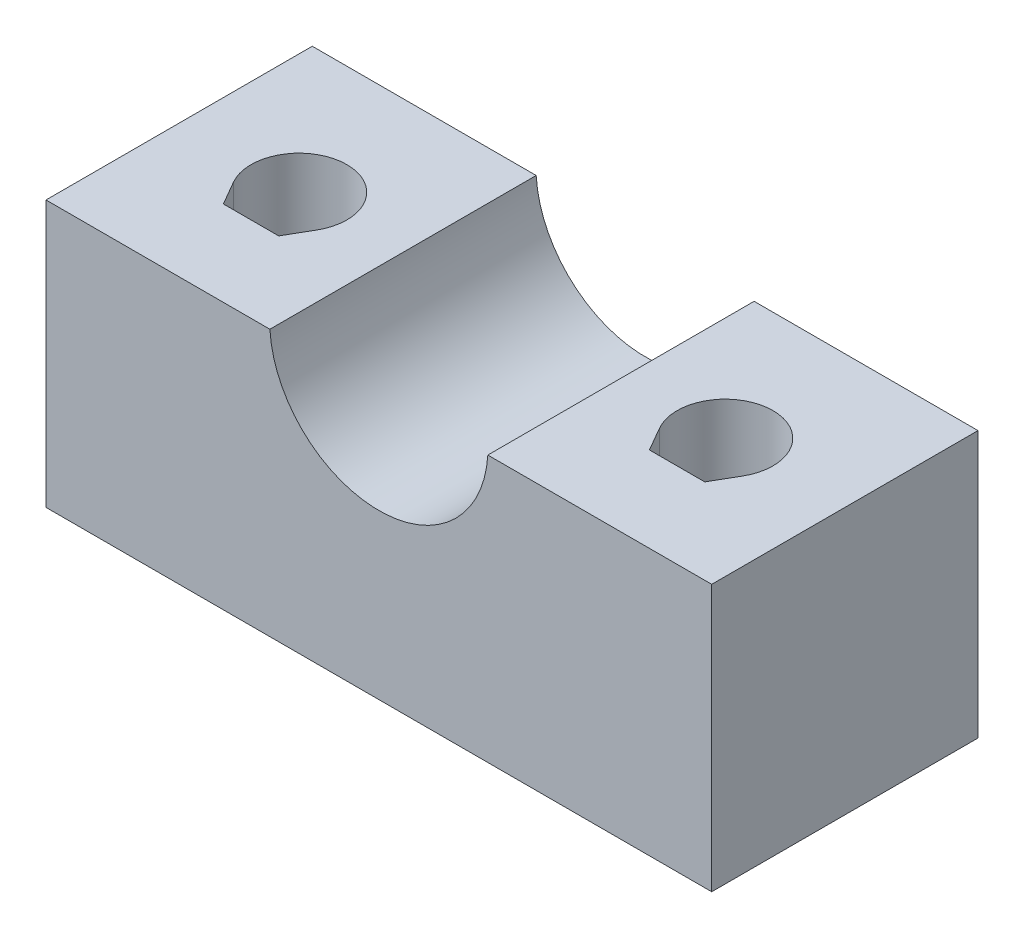
ISO-10303-21;
HEADER;
FILE_DESCRIPTION(('STEP AP214'),'2;1');
FILE_NAME('part.step','',(''),(''),'','','');
FILE_SCHEMA(('AUTOMOTIVE_DESIGN { 1 0 10303 214 1 1 1 1 }'));
ENDSEC;
DATA;
#1=APPLICATION_CONTEXT('core data for automotive mechanical design processes');
#2=APPLICATION_PROTOCOL_DEFINITION('international standard','automotive_design',2000,#1);
#3=PRODUCT_CONTEXT('',#1,'mechanical');
#4=PRODUCT('Part','Part','',(#3));
#5=PRODUCT_RELATED_PRODUCT_CATEGORY('part','',(#4));
#6=PRODUCT_DEFINITION_FORMATION('','',#4);
#7=PRODUCT_DEFINITION_CONTEXT('part definition',#1,'design');
#8=PRODUCT_DEFINITION('design','',#6,#7);
#9=PRODUCT_DEFINITION_SHAPE('','',#8);
#10=(LENGTH_UNIT() NAMED_UNIT(*) SI_UNIT(.MILLI.,.METRE.));
#11=(NAMED_UNIT(*) PLANE_ANGLE_UNIT() SI_UNIT($,.RADIAN.));
#12=(NAMED_UNIT(*) SI_UNIT($,.STERADIAN.) SOLID_ANGLE_UNIT());
#13=UNCERTAINTY_MEASURE_WITH_UNIT(LENGTH_MEASURE(1.E-05),#10,'distance_accuracy_value','');
#14=(GEOMETRIC_REPRESENTATION_CONTEXT(3) GLOBAL_UNCERTAINTY_ASSIGNED_CONTEXT((#13)) GLOBAL_UNIT_ASSIGNED_CONTEXT((#10,
#11,#12)) REPRESENTATION_CONTEXT('',''));
#15=CARTESIAN_POINT('',(0.,0.,0.));
#16=DIRECTION('',(0.,0.,1.));
#17=DIRECTION('',(1.,0.,0.));
#18=AXIS2_PLACEMENT_3D('',#15,#16,#17);
#19=CARTESIAN_POINT('',(-12.5,-5.,5.));
#20=DIRECTION('',(0.,1.,0.));
#21=DIRECTION('',(0.,0.,1.));
#22=AXIS2_PLACEMENT_3D('',#19,#20,#21);
#23=PLANE('',#22);
#24=DIRECTION('',(1.,0.,0.));
#25=VECTOR('',#24,1.);
#26=CARTESIAN_POINT('',(-12.5,-5.,-5.));
#27=LINE('',#26,#25);
#28=CARTESIAN_POINT('',(-12.5,-5.,-5.));
#29=VERTEX_POINT('',#28);
#30=CARTESIAN_POINT('',(12.5,-5.,-5.));
#31=VERTEX_POINT('',#30);
#32=EDGE_CURVE('E218',#29,#31,#27,.T.);
#33=ORIENTED_EDGE('',*,*,#32,.T.);
#34=DIRECTION('',(0.,0.,-1.));
#35=VECTOR('',#34,1.);
#36=CARTESIAN_POINT('',(12.5,-5.,5.));
#37=LINE('',#36,#35);
#38=CARTESIAN_POINT('',(12.5,-5.,5.));
#39=VERTEX_POINT('',#38);
#40=EDGE_CURVE('E228',#39,#31,#37,.T.);
#41=ORIENTED_EDGE('',*,*,#40,.F.);
#42=DIRECTION('',(1.,0.,0.));
#43=VECTOR('',#42,1.);
#44=CARTESIAN_POINT('',(-12.5,-5.,5.));
#45=LINE('',#44,#43);
#46=CARTESIAN_POINT('',(-12.5,-5.,5.));
#47=VERTEX_POINT('',#46);
#48=EDGE_CURVE('E202',#47,#39,#45,.T.);
#49=ORIENTED_EDGE('',*,*,#48,.F.);
#50=DIRECTION('',(0.,0.,-1.));
#51=VECTOR('',#50,1.);
#52=CARTESIAN_POINT('',(-12.5,-5.,5.));
#53=LINE('',#52,#51);
#54=EDGE_CURVE('E226',#47,#29,#53,.T.);
#55=ORIENTED_EDGE('',*,*,#54,.T.);
#56=EDGE_LOOP('',(#33,#41,#49,#55));
#57=FACE_BOUND('',#56,.T.);
#58=CARTESIAN_POINT('',(-8.,-5.,0.));
#59=DIRECTION('',(0.,-1.,0.));
#60=DIRECTION('',(0.,0.,-1.));
#61=AXIS2_PLACEMENT_3D('',#58,#59,#60);
#62=CIRCLE('',#61,1.8);
#63=CARTESIAN_POINT('',(-9.55884572681199,-5.,0.900000000000008));
#64=VERTEX_POINT('',#63);
#65=CARTESIAN_POINT('',(-6.44115427318801,-5.,0.900000000000008));
#66=VERTEX_POINT('',#65);
#67=EDGE_CURVE('E171',#64,#66,#62,.T.);
#68=ORIENTED_EDGE('',*,*,#67,.F.);
#69=DIRECTION('',(-0.500000000000004,0.,-0.866025403784436));
#70=VECTOR('',#69,1.);
#71=CARTESIAN_POINT('',(-9.03923048454132,-5.,1.8));
#72=LINE('',#71,#70);
#73=CARTESIAN_POINT('',(-9.03923048454132,-5.,1.8));
#74=VERTEX_POINT('',#73);
#75=EDGE_CURVE('E169',#74,#64,#72,.T.);
#76=ORIENTED_EDGE('',*,*,#75,.F.);
#77=DIRECTION('',(-1.,0.,0.));
#78=VECTOR('',#77,1.);
#79=CARTESIAN_POINT('',(-6.96076951545868,-5.,1.8));
#80=LINE('',#79,#78);
#81=CARTESIAN_POINT('',(-6.96076951545868,-5.,1.8));
#82=VERTEX_POINT('',#81);
#83=EDGE_CURVE('E177',#82,#74,#80,.T.);
#84=ORIENTED_EDGE('',*,*,#83,.F.);
#85=DIRECTION('',(0.500000000000005,0.,-0.866025403784436));
#86=VECTOR('',#85,1.);
#87=CARTESIAN_POINT('',(-6.96076951545868,-5.,1.8));
#88=LINE('',#87,#86);
#89=EDGE_CURVE('E174',#82,#66,#88,.T.);
#90=ORIENTED_EDGE('',*,*,#89,.T.);
#91=EDGE_LOOP('',(#68,#76,#84,#90));
#92=FACE_BOUND('',#91,.T.);
#93=DIRECTION('',(0.500000000000004,0.,-0.866025403784436));
#94=VECTOR('',#93,1.);
#95=CARTESIAN_POINT('',(9.03923048454132,-5.,1.8));
#96=LINE('',#95,#94);
#97=CARTESIAN_POINT('',(9.03923048454132,-5.,1.8));
#98=VERTEX_POINT('',#97);
#99=CARTESIAN_POINT('',(9.55884572681199,-5.,0.900000000000009));
#100=VERTEX_POINT('',#99);
#101=EDGE_CURVE('E52',#98,#100,#96,.T.);
#102=ORIENTED_EDGE('',*,*,#101,.T.);
#103=CARTESIAN_POINT('',(8.,-5.,0.));
#104=DIRECTION('',(0.,1.,0.));
#105=DIRECTION('',(0.,0.,1.));
#106=AXIS2_PLACEMENT_3D('',#103,#104,#105);
#107=CIRCLE('',#106,1.8);
#108=CARTESIAN_POINT('',(6.44115427318801,-5.,0.900000000000009));
#109=VERTEX_POINT('',#108);
#110=EDGE_CURVE('E143',#100,#109,#107,.T.);
#111=ORIENTED_EDGE('',*,*,#110,.T.);
#112=DIRECTION('',(-0.500000000000003,0.,-0.866025403784437));
#113=VECTOR('',#112,1.);
#114=CARTESIAN_POINT('',(6.96076951545868,-5.,1.8));
#115=LINE('',#114,#113);
#116=CARTESIAN_POINT('',(6.96076951545868,-5.,1.8));
#117=VERTEX_POINT('',#116);
#118=EDGE_CURVE('E268',#117,#109,#115,.T.);
#119=ORIENTED_EDGE('',*,*,#118,.F.);
#120=DIRECTION('',(1.,0.,0.));
#121=VECTOR('',#120,1.);
#122=CARTESIAN_POINT('',(6.96076951545868,-5.,1.8));
#123=LINE('',#122,#121);
#124=EDGE_CURVE('E267',#117,#98,#123,.T.);
#125=ORIENTED_EDGE('',*,*,#124,.T.);
#126=EDGE_LOOP('',(#102,#111,#119,#125));
#127=FACE_BOUND('',#126,.T.);
#128=ADVANCED_FACE('F35',(#57,#92,#127),#23,.F.);
#129=CARTESIAN_POINT('',(4.09237095092808,5.,5.));
#130=DIRECTION('',(0.,1.,0.));
#131=DIRECTION('',(0.,0.,1.));
#132=AXIS2_PLACEMENT_3D('',#129,#130,#131);
#133=PLANE('',#132);
#134=DIRECTION('',(1.,0.,0.));
#135=VECTOR('',#134,1.);
#136=CARTESIAN_POINT('',(4.09237095092808,5.,-5.));
#137=LINE('',#136,#135);
#138=CARTESIAN_POINT('',(4.09237095092808,5.,-5.));
#139=VERTEX_POINT('',#138);
#140=CARTESIAN_POINT('',(12.5,5.,-5.));
#141=VERTEX_POINT('',#140);
#142=EDGE_CURVE('E212',#139,#141,#137,.T.);
#143=ORIENTED_EDGE('',*,*,#142,.F.);
#144=DIRECTION('',(0.,0.,-1.));
#145=VECTOR('',#144,1.);
#146=CARTESIAN_POINT('',(4.09237095092808,5.,5.));
#147=LINE('',#146,#145);
#148=CARTESIAN_POINT('',(4.09237095092808,5.,5.));
#149=VERTEX_POINT('',#148);
#150=EDGE_CURVE('E39',#149,#139,#147,.T.);
#151=ORIENTED_EDGE('',*,*,#150,.F.);
#152=DIRECTION('',(1.,0.,0.));
#153=VECTOR('',#152,1.);
#154=CARTESIAN_POINT('',(4.09237095092808,5.,5.));
#155=LINE('',#154,#153);
#156=CARTESIAN_POINT('',(12.5,5.,5.));
#157=VERTEX_POINT('',#156);
#158=EDGE_CURVE('E196',#149,#157,#155,.T.);
#159=ORIENTED_EDGE('',*,*,#158,.T.);
#160=DIRECTION('',(0.,0.,-1.));
#161=VECTOR('',#160,1.);
#162=CARTESIAN_POINT('',(12.5,5.,5.));
#163=LINE('',#162,#161);
#164=EDGE_CURVE('E230',#157,#141,#163,.T.);
#165=ORIENTED_EDGE('',*,*,#164,.T.);
#166=EDGE_LOOP('',(#143,#151,#159,#165));
#167=FACE_BOUND('',#166,.T.);
#168=CARTESIAN_POINT('',(8.,5.,0.));
#169=DIRECTION('',(0.,1.,0.));
#170=DIRECTION('',(0.,0.,1.));
#171=AXIS2_PLACEMENT_3D('',#168,#169,#170);
#172=CIRCLE('',#171,1.8);
#173=CARTESIAN_POINT('',(9.55884572681199,5.,0.900000000000009));
#174=VERTEX_POINT('',#173);
#175=CARTESIAN_POINT('',(6.44115427318801,5.,0.900000000000009));
#176=VERTEX_POINT('',#175);
#177=EDGE_CURVE('E141',#174,#176,#172,.T.);
#178=ORIENTED_EDGE('',*,*,#177,.F.);
#179=DIRECTION('',(0.500000000000004,0.,-0.866025403784436));
#180=VECTOR('',#179,1.);
#181=CARTESIAN_POINT('',(9.03923048454132,5.,1.8));
#182=LINE('',#181,#180);
#183=CARTESIAN_POINT('',(9.03923048454132,5.,1.8));
#184=VERTEX_POINT('',#183);
#185=EDGE_CURVE('E148',#184,#174,#182,.T.);
#186=ORIENTED_EDGE('',*,*,#185,.F.);
#187=DIRECTION('',(1.,0.,0.));
#188=VECTOR('',#187,1.);
#189=CARTESIAN_POINT('',(6.96076951545868,5.,1.8));
#190=LINE('',#189,#188);
#191=CARTESIAN_POINT('',(6.96076951545868,5.,1.8));
#192=VERTEX_POINT('',#191);
#193=EDGE_CURVE('E145',#192,#184,#190,.T.);
#194=ORIENTED_EDGE('',*,*,#193,.F.);
#195=DIRECTION('',(-0.500000000000003,0.,-0.866025403784437));
#196=VECTOR('',#195,1.);
#197=CARTESIAN_POINT('',(6.96076951545868,5.,1.8));
#198=LINE('',#197,#196);
#199=EDGE_CURVE('E60',#192,#176,#198,.T.);
#200=ORIENTED_EDGE('',*,*,#199,.T.);
#201=EDGE_LOOP('',(#178,#186,#194,#200));
#202=FACE_BOUND('',#201,.T.);
#203=ADVANCED_FACE('F155',(#167,#202),#133,.T.);
#204=CARTESIAN_POINT('',(0.,5.25,5.));
#205=DIRECTION('',(0.,0.,-1.));
#206=DIRECTION('',(-1.,0.,0.));
#207=AXIS2_PLACEMENT_3D('',#204,#205,#206);
#208=CYLINDRICAL_SURFACE('',#207,4.1);
#209=CARTESIAN_POINT('',(0.,5.25,-5.));
#210=DIRECTION('',(0.,0.,1.));
#211=DIRECTION('',(1.,0.,0.));
#212=AXIS2_PLACEMENT_3D('',#209,#210,#211);
#213=CIRCLE('',#212,4.1);
#214=CARTESIAN_POINT('',(-4.09237095092808,5.,-5.));
#215=VERTEX_POINT('',#214);
#216=EDGE_CURVE('E192',#215,#139,#213,.T.);
#217=ORIENTED_EDGE('',*,*,#216,.F.);
#218=DIRECTION('',(0.,0.,-1.));
#219=VECTOR('',#218,1.);
#220=CARTESIAN_POINT('',(-4.09237095092808,5.,5.));
#221=LINE('',#220,#219);
#222=CARTESIAN_POINT('',(-4.09237095092808,5.,5.));
#223=VERTEX_POINT('',#222);
#224=EDGE_CURVE('E11',#223,#215,#221,.T.);
#225=ORIENTED_EDGE('',*,*,#224,.F.);
#226=CARTESIAN_POINT('',(0.,5.25,5.));
#227=DIRECTION('',(0.,0.,1.));
#228=DIRECTION('',(1.,0.,0.));
#229=AXIS2_PLACEMENT_3D('',#226,#227,#228);
#230=CIRCLE('',#229,4.1);
#231=EDGE_CURVE('E193',#223,#149,#230,.T.);
#232=ORIENTED_EDGE('',*,*,#231,.T.);
#233=ORIENTED_EDGE('',*,*,#150,.T.);
#234=EDGE_LOOP('',(#217,#225,#232,#233));
#235=FACE_BOUND('',#234,.T.);
#236=ADVANCED_FACE('F37',(#235),#208,.F.);
#237=CARTESIAN_POINT('',(-12.5,5.,5.));
#238=DIRECTION('',(0.,1.,0.));
#239=DIRECTION('',(-1.,0.,0.));
#240=AXIS2_PLACEMENT_3D('',#237,#238,#239);
#241=PLANE('',#240);
#242=DIRECTION('',(-0.500000000000004,0.,-0.866025403784436));
#243=VECTOR('',#242,1.);
#244=CARTESIAN_POINT('',(-9.03923048454132,5.,1.8));
#245=LINE('',#244,#243);
#246=CARTESIAN_POINT('',(-9.03923048454132,5.,1.8));
#247=VERTEX_POINT('',#246);
#248=CARTESIAN_POINT('',(-9.55884572681199,5.,0.900000000000008));
#249=VERTEX_POINT('',#248);
#250=EDGE_CURVE('E166',#247,#249,#245,.T.);
#251=ORIENTED_EDGE('',*,*,#250,.T.);
#252=CARTESIAN_POINT('',(-8.,5.,0.));
#253=DIRECTION('',(0.,1.,0.));
#254=DIRECTION('',(-1.,0.,0.));
#255=AXIS2_PLACEMENT_3D('',#252,#253,#254);
#256=CIRCLE('',#255,1.8);
#257=CARTESIAN_POINT('',(-6.44115427318801,5.,0.900000000000008));
#258=VERTEX_POINT('',#257);
#259=EDGE_CURVE('E183',#249,#258,#256,.F.);
#260=ORIENTED_EDGE('',*,*,#259,.T.);
#261=DIRECTION('',(0.500000000000005,0.,-0.866025403784436));
#262=VECTOR('',#261,1.);
#263=CARTESIAN_POINT('',(-6.96076951545868,5.,1.8));
#264=LINE('',#263,#262);
#265=CARTESIAN_POINT('',(-6.96076951545868,5.,1.8));
#266=VERTEX_POINT('',#265);
#267=EDGE_CURVE('E157',#266,#258,#264,.T.);
#268=ORIENTED_EDGE('',*,*,#267,.F.);
#269=DIRECTION('',(-1.,0.,0.));
#270=VECTOR('',#269,1.);
#271=CARTESIAN_POINT('',(-6.96076951545868,5.,1.8));
#272=LINE('',#271,#270);
#273=EDGE_CURVE('E163',#266,#247,#272,.T.);
#274=ORIENTED_EDGE('',*,*,#273,.T.);
#275=EDGE_LOOP('',(#251,#260,#268,#274));
#276=FACE_BOUND('',#275,.T.);
#277=DIRECTION('',(1.,0.,0.));
#278=VECTOR('',#277,1.);
#279=CARTESIAN_POINT('',(-12.5,5.,-5.));
#280=LINE('',#279,#278);
#281=CARTESIAN_POINT('',(-12.5,5.,-5.));
#282=VERTEX_POINT('',#281);
#283=EDGE_CURVE('E197',#282,#215,#280,.T.);
#284=ORIENTED_EDGE('',*,*,#283,.F.);
#285=DIRECTION('',(0.,0.,-1.));
#286=VECTOR('',#285,1.);
#287=CARTESIAN_POINT('',(-12.5,5.,5.));
#288=LINE('',#287,#286);
#289=CARTESIAN_POINT('',(-12.5,5.,5.));
#290=VERTEX_POINT('',#289);
#291=EDGE_CURVE('E44',#290,#282,#288,.T.);
#292=ORIENTED_EDGE('',*,*,#291,.F.);
#293=DIRECTION('',(1.,0.,0.));
#294=VECTOR('',#293,1.);
#295=CARTESIAN_POINT('',(-12.5,5.,5.));
#296=LINE('',#295,#294);
#297=EDGE_CURVE('E207',#290,#223,#296,.T.);
#298=ORIENTED_EDGE('',*,*,#297,.T.);
#299=ORIENTED_EDGE('',*,*,#224,.T.);
#300=EDGE_LOOP('',(#284,#292,#298,#299));
#301=FACE_BOUND('',#300,.T.);
#302=ADVANCED_FACE('F245',(#276,#301),#241,.T.);
#303=CARTESIAN_POINT('',(-12.5,-5.,5.));
#304=DIRECTION('',(-1.,0.,0.));
#305=DIRECTION('',(0.,0.,1.));
#306=AXIS2_PLACEMENT_3D('',#303,#304,#305);
#307=PLANE('',#306);
#308=DIRECTION('',(0.,1.,0.));
#309=VECTOR('',#308,1.);
#310=CARTESIAN_POINT('',(-12.5,-5.,-5.));
#311=LINE('',#310,#309);
#312=EDGE_CURVE('E220',#29,#282,#311,.T.);
#313=ORIENTED_EDGE('',*,*,#312,.F.);
#314=ORIENTED_EDGE('',*,*,#54,.F.);
#315=DIRECTION('',(0.,1.,0.));
#316=VECTOR('',#315,1.);
#317=CARTESIAN_POINT('',(-12.5,-5.,5.));
#318=LINE('',#317,#316);
#319=EDGE_CURVE('E204',#47,#290,#318,.T.);
#320=ORIENTED_EDGE('',*,*,#319,.T.);
#321=ORIENTED_EDGE('',*,*,#291,.T.);
#322=EDGE_LOOP('',(#313,#314,#320,#321));
#323=FACE_BOUND('',#322,.T.);
#324=ADVANCED_FACE('F257',(#323),#307,.T.);
#325=CARTESIAN_POINT('',(12.5,-5.,5.));
#326=DIRECTION('',(-1.,0.,0.));
#327=DIRECTION('',(0.,0.,1.));
#328=AXIS2_PLACEMENT_3D('',#325,#326,#327);
#329=PLANE('',#328);
#330=DIRECTION('',(0.,1.,0.));
#331=VECTOR('',#330,1.);
#332=CARTESIAN_POINT('',(12.5,-5.,-5.));
#333=LINE('',#332,#331);
#334=EDGE_CURVE('E215',#31,#141,#333,.T.);
#335=ORIENTED_EDGE('',*,*,#334,.T.);
#336=ORIENTED_EDGE('',*,*,#164,.F.);
#337=DIRECTION('',(0.,1.,0.));
#338=VECTOR('',#337,1.);
#339=CARTESIAN_POINT('',(12.5,-5.,5.));
#340=LINE('',#339,#338);
#341=EDGE_CURVE('E200',#39,#157,#340,.T.);
#342=ORIENTED_EDGE('',*,*,#341,.F.);
#343=ORIENTED_EDGE('',*,*,#40,.T.);
#344=EDGE_LOOP('',(#335,#336,#342,#343));
#345=FACE_BOUND('',#344,.T.);
#346=ADVANCED_FACE('F254',(#345),#329,.F.);
#347=CARTESIAN_POINT('',(0.,5.25,5.));
#348=DIRECTION('',(0.,0.,1.));
#349=DIRECTION('',(1.,0.,0.));
#350=AXIS2_PLACEMENT_3D('',#347,#348,#349);
#351=PLANE('',#350);
#352=ORIENTED_EDGE('',*,*,#231,.F.);
#353=ORIENTED_EDGE('',*,*,#297,.F.);
#354=ORIENTED_EDGE('',*,*,#319,.F.);
#355=ORIENTED_EDGE('',*,*,#48,.T.);
#356=ORIENTED_EDGE('',*,*,#341,.T.);
#357=ORIENTED_EDGE('',*,*,#158,.F.);
#358=EDGE_LOOP('',(#352,#353,#354,#355,#356,#357));
#359=FACE_BOUND('',#358,.T.);
#360=ADVANCED_FACE('F248',(#359),#351,.T.);
#361=CARTESIAN_POINT('',(0.,5.25,-5.));
#362=DIRECTION('',(0.,0.,1.));
#363=DIRECTION('',(1.,0.,0.));
#364=AXIS2_PLACEMENT_3D('',#361,#362,#363);
#365=PLANE('',#364);
#366=ORIENTED_EDGE('',*,*,#216,.T.);
#367=ORIENTED_EDGE('',*,*,#142,.T.);
#368=ORIENTED_EDGE('',*,*,#334,.F.);
#369=ORIENTED_EDGE('',*,*,#32,.F.);
#370=ORIENTED_EDGE('',*,*,#312,.T.);
#371=ORIENTED_EDGE('',*,*,#283,.T.);
#372=EDGE_LOOP('',(#366,#367,#368,#369,#370,#371));
#373=FACE_BOUND('',#372,.T.);
#374=ADVANCED_FACE('F240',(#373),#365,.F.);
#375=CARTESIAN_POINT('',(-9.03923048454132,5.001,1.8));
#376=DIRECTION('',(-0.866025403784436,0.,0.500000000000004));
#377=DIRECTION('',(0.500000000000004,0.,0.866025403784436));
#378=AXIS2_PLACEMENT_3D('',#375,#376,#377);
#379=PLANE('',#378);
#380=DIRECTION('',(0.,-1.,0.));
#381=VECTOR('',#380,1.);
#382=CARTESIAN_POINT('',(-9.03923048454132,5.001,1.8));
#383=LINE('',#382,#381);
#384=EDGE_CURVE('E181',#247,#74,#383,.T.);
#385=ORIENTED_EDGE('',*,*,#384,.T.);
#386=ORIENTED_EDGE('',*,*,#75,.T.);
#387=DIRECTION('',(0.,-1.,0.));
#388=VECTOR('',#387,1.);
#389=CARTESIAN_POINT('',(-9.55884572681199,5.001,0.900000000000008));
#390=LINE('',#389,#388);
#391=EDGE_CURVE('E180',#249,#64,#390,.T.);
#392=ORIENTED_EDGE('',*,*,#391,.F.);
#393=ORIENTED_EDGE('',*,*,#250,.F.);
#394=EDGE_LOOP('',(#385,#386,#392,#393));
#395=FACE_BOUND('',#394,.T.);
#396=ADVANCED_FACE('F295',(#395),#379,.F.);
#397=CARTESIAN_POINT('',(-6.96076951545868,5.001,1.8));
#398=DIRECTION('',(0.,0.,1.));
#399=DIRECTION('',(1.,0.,0.));
#400=AXIS2_PLACEMENT_3D('',#397,#398,#399);
#401=PLANE('',#400);
#402=DIRECTION('',(0.,-1.,0.));
#403=VECTOR('',#402,1.);
#404=CARTESIAN_POINT('',(-6.96076951545868,5.001,1.8));
#405=LINE('',#404,#403);
#406=EDGE_CURVE('E184',#266,#82,#405,.T.);
#407=ORIENTED_EDGE('',*,*,#406,.T.);
#408=ORIENTED_EDGE('',*,*,#83,.T.);
#409=ORIENTED_EDGE('',*,*,#384,.F.);
#410=ORIENTED_EDGE('',*,*,#273,.F.);
#411=EDGE_LOOP('',(#407,#408,#409,#410));
#412=FACE_BOUND('',#411,.T.);
#413=ADVANCED_FACE('F291',(#412),#401,.F.);
#414=CARTESIAN_POINT('',(-6.96076951545868,5.001,1.8));
#415=DIRECTION('',(-0.866025403784436,0.,-0.500000000000005));
#416=DIRECTION('',(-0.500000000000005,0.,0.866025403784436));
#417=AXIS2_PLACEMENT_3D('',#414,#415,#416);
#418=PLANE('',#417);
#419=ORIENTED_EDGE('',*,*,#267,.T.);
#420=DIRECTION('',(0.,-1.,0.));
#421=VECTOR('',#420,1.);
#422=CARTESIAN_POINT('',(-6.44115427318801,5.001,0.900000000000008));
#423=LINE('',#422,#421);
#424=EDGE_CURVE('E186',#258,#66,#423,.T.);
#425=ORIENTED_EDGE('',*,*,#424,.T.);
#426=ORIENTED_EDGE('',*,*,#89,.F.);
#427=ORIENTED_EDGE('',*,*,#406,.F.);
#428=EDGE_LOOP('',(#419,#425,#426,#427));
#429=FACE_BOUND('',#428,.T.);
#430=ADVANCED_FACE('F294',(#429),#418,.T.);
#431=CARTESIAN_POINT('',(-8.,5.001,0.));
#432=DIRECTION('',(0.,-1.,0.));
#433=DIRECTION('',(0.,0.,-1.));
#434=AXIS2_PLACEMENT_3D('',#431,#432,#433);
#435=CYLINDRICAL_SURFACE('',#434,1.8);
#436=ORIENTED_EDGE('',*,*,#391,.T.);
#437=ORIENTED_EDGE('',*,*,#67,.T.);
#438=ORIENTED_EDGE('',*,*,#424,.F.);
#439=ORIENTED_EDGE('',*,*,#259,.F.);
#440=EDGE_LOOP('',(#436,#437,#438,#439));
#441=FACE_BOUND('',#440,.T.);
#442=ADVANCED_FACE('F299',(#441),#435,.F.);
#443=CARTESIAN_POINT('',(9.03923048454132,5.001,1.8));
#444=DIRECTION('',(-0.866025403784436,0.,-0.500000000000004));
#445=DIRECTION('',(-0.500000000000004,0.,0.866025403784436));
#446=AXIS2_PLACEMENT_3D('',#443,#444,#445);
#447=PLANE('',#446);
#448=ORIENTED_EDGE('',*,*,#185,.T.);
#449=DIRECTION('',(0.,-1.,0.));
#450=VECTOR('',#449,1.);
#451=CARTESIAN_POINT('',(9.55884572681199,5.001,0.900000000000009));
#452=LINE('',#451,#450);
#453=EDGE_CURVE('E137',#174,#100,#452,.T.);
#454=ORIENTED_EDGE('',*,*,#453,.T.);
#455=ORIENTED_EDGE('',*,*,#101,.F.);
#456=DIRECTION('',(0.,-1.,0.));
#457=VECTOR('',#456,1.);
#458=CARTESIAN_POINT('',(9.03923048454132,5.001,1.8));
#459=LINE('',#458,#457);
#460=EDGE_CURVE('E150',#184,#98,#459,.T.);
#461=ORIENTED_EDGE('',*,*,#460,.F.);
#462=EDGE_LOOP('',(#448,#454,#455,#461));
#463=FACE_BOUND('',#462,.T.);
#464=ADVANCED_FACE('F149',(#463),#447,.T.);
#465=CARTESIAN_POINT('',(8.,5.001,0.));
#466=DIRECTION('',(0.,-1.,0.));
#467=DIRECTION('',(0.,0.,-1.));
#468=AXIS2_PLACEMENT_3D('',#465,#466,#467);
#469=CYLINDRICAL_SURFACE('',#468,1.8);
#470=ORIENTED_EDGE('',*,*,#177,.T.);
#471=DIRECTION('',(0.,-1.,0.));
#472=VECTOR('',#471,1.);
#473=CARTESIAN_POINT('',(6.44115427318801,5.001,0.900000000000009));
#474=LINE('',#473,#472);
#475=EDGE_CURVE('E144',#176,#109,#474,.T.);
#476=ORIENTED_EDGE('',*,*,#475,.T.);
#477=ORIENTED_EDGE('',*,*,#110,.F.);
#478=ORIENTED_EDGE('',*,*,#453,.F.);
#479=EDGE_LOOP('',(#470,#476,#477,#478));
#480=FACE_BOUND('',#479,.T.);
#481=ADVANCED_FACE('F139',(#480),#469,.F.);
#482=CARTESIAN_POINT('',(6.96076951545868,5.001,1.8));
#483=DIRECTION('',(-0.866025403784437,0.,0.500000000000003));
#484=DIRECTION('',(0.500000000000003,0.,0.866025403784437));
#485=AXIS2_PLACEMENT_3D('',#482,#483,#484);
#486=PLANE('',#485);
#487=DIRECTION('',(0.,-1.,0.));
#488=VECTOR('',#487,1.);
#489=CARTESIAN_POINT('',(6.96076951545868,5.001,1.8));
#490=LINE('',#489,#488);
#491=EDGE_CURVE('E275',#192,#117,#490,.T.);
#492=ORIENTED_EDGE('',*,*,#491,.T.);
#493=ORIENTED_EDGE('',*,*,#118,.T.);
#494=ORIENTED_EDGE('',*,*,#475,.F.);
#495=ORIENTED_EDGE('',*,*,#199,.F.);
#496=EDGE_LOOP('',(#492,#493,#494,#495));
#497=FACE_BOUND('',#496,.T.);
#498=ADVANCED_FACE('F280',(#497),#486,.F.);
#499=CARTESIAN_POINT('',(6.96076951545868,5.001,1.8));
#500=DIRECTION('',(0.,0.,-1.));
#501=DIRECTION('',(-1.,0.,0.));
#502=AXIS2_PLACEMENT_3D('',#499,#500,#501);
#503=PLANE('',#502);
#504=ORIENTED_EDGE('',*,*,#193,.T.);
#505=ORIENTED_EDGE('',*,*,#460,.T.);
#506=ORIENTED_EDGE('',*,*,#124,.F.);
#507=ORIENTED_EDGE('',*,*,#491,.F.);
#508=EDGE_LOOP('',(#504,#505,#506,#507));
#509=FACE_BOUND('',#508,.T.);
#510=ADVANCED_FACE('F279',(#509),#503,.T.);
#511=CLOSED_SHELL('',(#128,#203,#236,#302,#324,#346,#360,#374,#396,#413,#430,#442,#464,#481,
#498,#510));
#512=MANIFOLD_SOLID_BREP('B2',#511);
#513=ADVANCED_BREP_SHAPE_REPRESENTATION('',(#18,#512),#14);
#514=SHAPE_DEFINITION_REPRESENTATION(#9,#513);
ENDSEC;
END-ISO-10303-21;
